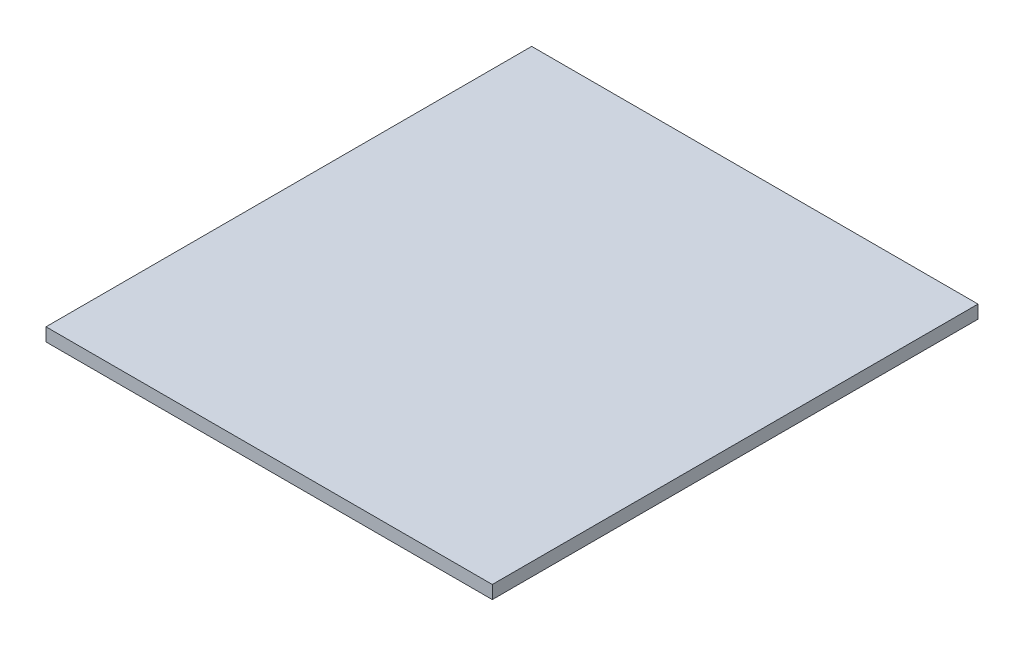
ISO-10303-21;
HEADER;
FILE_DESCRIPTION(('STEP AP214'),'2;1');
FILE_NAME('part.step','',(''),(''),'','','');
FILE_SCHEMA(('AUTOMOTIVE_DESIGN { 1 0 10303 214 1 1 1 1 }'));
ENDSEC;
DATA;
#1=APPLICATION_CONTEXT('core data for automotive mechanical design processes');
#2=APPLICATION_PROTOCOL_DEFINITION('international standard','automotive_design',2000,#1);
#3=PRODUCT_CONTEXT('',#1,'mechanical');
#4=PRODUCT('Part','Part','',(#3));
#5=PRODUCT_RELATED_PRODUCT_CATEGORY('part','',(#4));
#6=PRODUCT_DEFINITION_FORMATION('','',#4);
#7=PRODUCT_DEFINITION_CONTEXT('part definition',#1,'design');
#8=PRODUCT_DEFINITION('design','',#6,#7);
#9=PRODUCT_DEFINITION_SHAPE('','',#8);
#10=(LENGTH_UNIT() NAMED_UNIT(*) SI_UNIT(.MILLI.,.METRE.));
#11=(NAMED_UNIT(*) PLANE_ANGLE_UNIT() SI_UNIT($,.RADIAN.));
#12=(NAMED_UNIT(*) SI_UNIT($,.STERADIAN.) SOLID_ANGLE_UNIT());
#13=UNCERTAINTY_MEASURE_WITH_UNIT(LENGTH_MEASURE(1.E-05),#10,'distance_accuracy_value','');
#14=(GEOMETRIC_REPRESENTATION_CONTEXT(3) GLOBAL_UNCERTAINTY_ASSIGNED_CONTEXT((#13)) GLOBAL_UNIT_ASSIGNED_CONTEXT((#10,
#11,#12)) REPRESENTATION_CONTEXT('',''));
#15=CARTESIAN_POINT('',(0.,0.,0.));
#16=DIRECTION('',(0.,0.,1.));
#17=DIRECTION('',(1.,0.,0.));
#18=AXIS2_PLACEMENT_3D('',#15,#16,#17);
#19=CARTESIAN_POINT('',(-75.,3.,75.));
#20=DIRECTION('',(0.,0.,-1.));
#21=DIRECTION('',(-1.,0.,0.));
#22=AXIS2_PLACEMENT_3D('',#19,#20,#21);
#23=PLANE('',#22);
#24=DIRECTION('',(1.,0.,0.));
#25=VECTOR('',#24,1.);
#26=CARTESIAN_POINT('',(-75.,0.,75.));
#27=LINE('',#26,#25);
#28=CARTESIAN_POINT('',(-50.,0.,75.));
#29=VERTEX_POINT('',#28);
#30=CARTESIAN_POINT('',(52.,0.,75.));
#31=VERTEX_POINT('',#30);
#32=EDGE_CURVE('E91',#29,#31,#27,.T.);
#33=ORIENTED_EDGE('',*,*,#32,.T.);
#34=DIRECTION('',(0.,1.,0.));
#35=VECTOR('',#34,1.);
#36=CARTESIAN_POINT('',(52.,-7.,75.));
#37=LINE('',#36,#35);
#38=CARTESIAN_POINT('',(52.,3.,75.));
#39=VERTEX_POINT('',#38);
#40=EDGE_CURVE('E54',#31,#39,#37,.T.);
#41=ORIENTED_EDGE('',*,*,#40,.T.);
#42=DIRECTION('',(1.,0.,0.));
#43=VECTOR('',#42,1.);
#44=CARTESIAN_POINT('',(-75.,3.,75.));
#45=LINE('',#44,#43);
#46=CARTESIAN_POINT('',(-50.,3.,75.));
#47=VERTEX_POINT('',#46);
#48=EDGE_CURVE('E87',#47,#39,#45,.T.);
#49=ORIENTED_EDGE('',*,*,#48,.F.);
#50=DIRECTION('',(0.,1.,0.));
#51=VECTOR('',#50,1.);
#52=CARTESIAN_POINT('',(-50.,-7.,75.));
#53=LINE('',#52,#51);
#54=EDGE_CURVE('E70',#29,#47,#53,.T.);
#55=ORIENTED_EDGE('',*,*,#54,.F.);
#56=EDGE_LOOP('',(#33,#41,#49,#55));
#57=FACE_BOUND('',#56,.T.);
#58=ADVANCED_FACE('F33',(#57),#23,.F.);
#59=CARTESIAN_POINT('',(0.,3.,0.));
#60=DIRECTION('',(0.,-1.,0.));
#61=DIRECTION('',(0.,0.,-1.));
#62=AXIS2_PLACEMENT_3D('',#59,#60,#61);
#63=PLANE('',#62);
#64=ORIENTED_EDGE('',*,*,#48,.T.);
#65=DIRECTION('',(0.,0.,1.));
#66=VECTOR('',#65,1.);
#67=CARTESIAN_POINT('',(52.,3.,-36.));
#68=LINE('',#67,#66);
#69=CARTESIAN_POINT('',(52.,3.,-36.));
#70=VERTEX_POINT('',#69);
#71=EDGE_CURVE('E81',#70,#39,#68,.T.);
#72=ORIENTED_EDGE('',*,*,#71,.F.);
#73=DIRECTION('',(1.,0.,0.));
#74=VECTOR('',#73,1.);
#75=CARTESIAN_POINT('',(-50.,3.,-36.));
#76=LINE('',#75,#74);
#77=CARTESIAN_POINT('',(-50.,3.,-36.));
#78=VERTEX_POINT('',#77);
#79=EDGE_CURVE('E89',#78,#70,#76,.T.);
#80=ORIENTED_EDGE('',*,*,#79,.F.);
#81=DIRECTION('',(0.,0.,-1.));
#82=VECTOR('',#81,1.);
#83=CARTESIAN_POINT('',(-50.,3.,75.));
#84=LINE('',#83,#82);
#85=EDGE_CURVE('E73',#47,#78,#84,.T.);
#86=ORIENTED_EDGE('',*,*,#85,.F.);
#87=EDGE_LOOP('',(#64,#72,#80,#86));
#88=FACE_BOUND('',#87,.T.);
#89=ADVANCED_FACE('F85',(#88),#63,.F.);
#90=CARTESIAN_POINT('',(0.,0.,0.));
#91=DIRECTION('',(0.,-1.,0.));
#92=DIRECTION('',(0.,0.,-1.));
#93=AXIS2_PLACEMENT_3D('',#90,#91,#92);
#94=PLANE('',#93);
#95=DIRECTION('',(0.,0.,-1.));
#96=VECTOR('',#95,1.);
#97=CARTESIAN_POINT('',(52.,0.,0.));
#98=LINE('',#97,#96);
#99=CARTESIAN_POINT('',(52.,0.,-36.));
#100=VERTEX_POINT('',#99);
#101=EDGE_CURVE('E11',#31,#100,#98,.T.);
#102=ORIENTED_EDGE('',*,*,#101,.F.);
#103=ORIENTED_EDGE('',*,*,#32,.F.);
#104=DIRECTION('',(0.,0.,1.));
#105=VECTOR('',#104,1.);
#106=CARTESIAN_POINT('',(-50.,0.,0.));
#107=LINE('',#106,#105);
#108=CARTESIAN_POINT('',(-50.,0.,-36.));
#109=VERTEX_POINT('',#108);
#110=EDGE_CURVE('E76',#109,#29,#107,.T.);
#111=ORIENTED_EDGE('',*,*,#110,.F.);
#112=DIRECTION('',(-1.,0.,0.));
#113=VECTOR('',#112,1.);
#114=CARTESIAN_POINT('',(0.,0.,-36.));
#115=LINE('',#114,#113);
#116=EDGE_CURVE('E40',#100,#109,#115,.T.);
#117=ORIENTED_EDGE('',*,*,#116,.F.);
#118=EDGE_LOOP('',(#102,#103,#111,#117));
#119=FACE_BOUND('',#118,.T.);
#120=ADVANCED_FACE('F102',(#119),#94,.T.);
#121=CARTESIAN_POINT('',(52.,-7.,-36.));
#122=DIRECTION('',(-1.,0.,0.));
#123=DIRECTION('',(0.,0.,1.));
#124=AXIS2_PLACEMENT_3D('',#121,#122,#123);
#125=PLANE('',#124);
#126=ORIENTED_EDGE('',*,*,#101,.T.);
#127=DIRECTION('',(0.,1.,0.));
#128=VECTOR('',#127,1.);
#129=CARTESIAN_POINT('',(52.,-7.,-36.));
#130=LINE('',#129,#128);
#131=EDGE_CURVE('E100',#100,#70,#130,.T.);
#132=ORIENTED_EDGE('',*,*,#131,.T.);
#133=ORIENTED_EDGE('',*,*,#71,.T.);
#134=ORIENTED_EDGE('',*,*,#40,.F.);
#135=EDGE_LOOP('',(#126,#132,#133,#134));
#136=FACE_BOUND('',#135,.T.);
#137=ADVANCED_FACE('F103',(#136),#125,.F.);
#138=CARTESIAN_POINT('',(-50.,-7.,-36.));
#139=DIRECTION('',(0.,0.,1.));
#140=DIRECTION('',(1.,0.,0.));
#141=AXIS2_PLACEMENT_3D('',#138,#139,#140);
#142=PLANE('',#141);
#143=ORIENTED_EDGE('',*,*,#116,.T.);
#144=DIRECTION('',(0.,1.,0.));
#145=VECTOR('',#144,1.);
#146=CARTESIAN_POINT('',(-50.,-7.,-36.));
#147=LINE('',#146,#145);
#148=EDGE_CURVE('E47',#109,#78,#147,.T.);
#149=ORIENTED_EDGE('',*,*,#148,.T.);
#150=ORIENTED_EDGE('',*,*,#79,.T.);
#151=ORIENTED_EDGE('',*,*,#131,.F.);
#152=EDGE_LOOP('',(#143,#149,#150,#151));
#153=FACE_BOUND('',#152,.T.);
#154=ADVANCED_FACE('F99',(#153),#142,.F.);
#155=CARTESIAN_POINT('',(-50.,-7.,75.));
#156=DIRECTION('',(1.,0.,0.));
#157=DIRECTION('',(0.,0.,-1.));
#158=AXIS2_PLACEMENT_3D('',#155,#156,#157);
#159=PLANE('',#158);
#160=ORIENTED_EDGE('',*,*,#110,.T.);
#161=ORIENTED_EDGE('',*,*,#54,.T.);
#162=ORIENTED_EDGE('',*,*,#85,.T.);
#163=ORIENTED_EDGE('',*,*,#148,.F.);
#164=EDGE_LOOP('',(#160,#161,#162,#163));
#165=FACE_BOUND('',#164,.T.);
#166=ADVANCED_FACE('F72',(#165),#159,.F.);
#167=CLOSED_SHELL('',(#58,#89,#120,#137,#154,#166));
#168=MANIFOLD_SOLID_BREP('B2',#167);
#169=ADVANCED_BREP_SHAPE_REPRESENTATION('',(#18,#168),#14);
#170=SHAPE_DEFINITION_REPRESENTATION(#9,#169);
ENDSEC;
END-ISO-10303-21;
